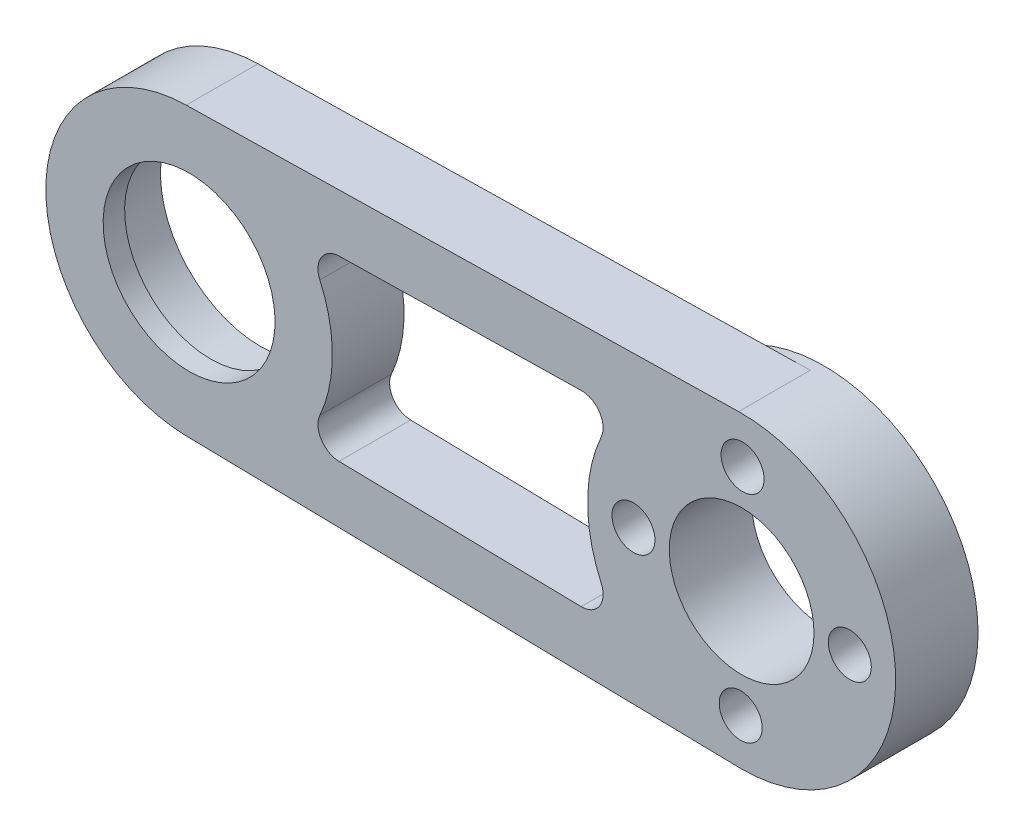
ISO-10303-21;
HEADER;
FILE_DESCRIPTION(('STEP AP214'),'2;1');
FILE_NAME('part.step','',(''),(''),'','','');
FILE_SCHEMA(('AUTOMOTIVE_DESIGN { 1 0 10303 214 1 1 1 1 }'));
ENDSEC;
DATA;
#1=APPLICATION_CONTEXT('core data for automotive mechanical design processes');
#2=APPLICATION_PROTOCOL_DEFINITION('international standard','automotive_design',2000,#1);
#3=PRODUCT_CONTEXT('',#1,'mechanical');
#4=PRODUCT('Part','Part','',(#3));
#5=PRODUCT_RELATED_PRODUCT_CATEGORY('part','',(#4));
#6=PRODUCT_DEFINITION_FORMATION('','',#4);
#7=PRODUCT_DEFINITION_CONTEXT('part definition',#1,'design');
#8=PRODUCT_DEFINITION('design','',#6,#7);
#9=PRODUCT_DEFINITION_SHAPE('','',#8);
#10=(LENGTH_UNIT() NAMED_UNIT(*) SI_UNIT(.MILLI.,.METRE.));
#11=(NAMED_UNIT(*) PLANE_ANGLE_UNIT() SI_UNIT($,.RADIAN.));
#12=(NAMED_UNIT(*) SI_UNIT($,.STERADIAN.) SOLID_ANGLE_UNIT());
#13=UNCERTAINTY_MEASURE_WITH_UNIT(LENGTH_MEASURE(1.E-05),#10,'distance_accuracy_value','');
#14=(GEOMETRIC_REPRESENTATION_CONTEXT(3) GLOBAL_UNCERTAINTY_ASSIGNED_CONTEXT((#13)) GLOBAL_UNIT_ASSIGNED_CONTEXT((#10,
#11,#12)) REPRESENTATION_CONTEXT('',''));
#15=CARTESIAN_POINT('',(0.,0.,0.));
#16=DIRECTION('',(0.,0.,1.));
#17=DIRECTION('',(1.,0.,0.));
#18=AXIS2_PLACEMENT_3D('',#15,#16,#17);
#19=CARTESIAN_POINT('',(39.3125,0.,89.2));
#20=DIRECTION('',(0.,0.,1.));
#21=DIRECTION('',(0.,1.,0.));
#22=AXIS2_PLACEMENT_3D('',#19,#20,#21);
#23=PLANE('',#22);
#24=CARTESIAN_POINT('',(62.0255521809238,0.129133880124579,89.2));
#25=DIRECTION('',(0.,0.,1.));
#26=DIRECTION('',(1.,0.,0.));
#27=AXIS2_PLACEMENT_3D('',#24,#25,#26);
#28=CIRCLE('',#27,3.00000000000002);
#29=CARTESIAN_POINT('',(65.0255521809238,0.129133880124579,89.2));
#30=VERTEX_POINT('',#29);
#31=EDGE_CURVE('E219',#30,#30,#28,.T.);
#32=ORIENTED_EDGE('',*,*,#31,.F.);
#33=EDGE_LOOP('',(#32));
#34=FACE_BOUND('',#33,.T.);
#35=CARTESIAN_POINT('',(77.2541338801246,15.0994478190762,89.2));
#36=DIRECTION('',(0.,0.,1.));
#37=DIRECTION('',(1.,0.,0.));
#38=AXIS2_PLACEMENT_3D('',#35,#36,#37);
#39=CIRCLE('',#38,3.00000000000002);
#40=CARTESIAN_POINT('',(80.2541338801246,15.0994478190762,89.2));
#41=VERTEX_POINT('',#40);
#42=EDGE_CURVE('E618',#41,#41,#39,.T.);
#43=ORIENTED_EDGE('',*,*,#42,.F.);
#44=EDGE_LOOP('',(#43));
#45=FACE_BOUND('',#44,.T.);
#46=CARTESIAN_POINT('',(92.2244478190762,-0.129133880124577,89.2));
#47=DIRECTION('',(0.,0.,1.));
#48=DIRECTION('',(1.,0.,0.));
#49=AXIS2_PLACEMENT_3D('',#46,#47,#48);
#50=CIRCLE('',#49,3.00000000000002);
#51=CARTESIAN_POINT('',(95.2244478190762,-0.129133880124577,89.2));
#52=VERTEX_POINT('',#51);
#53=EDGE_CURVE('E626',#52,#52,#50,.T.);
#54=ORIENTED_EDGE('',*,*,#53,.F.);
#55=EDGE_LOOP('',(#54));
#56=FACE_BOUND('',#55,.T.);
#57=CARTESIAN_POINT('',(76.9958661198754,-15.0994478190762,89.2));
#58=DIRECTION('',(0.,0.,1.));
#59=DIRECTION('',(1.,0.,0.));
#60=AXIS2_PLACEMENT_3D('',#57,#58,#59);
#61=CIRCLE('',#60,3.00000000000002);
#62=CARTESIAN_POINT('',(79.9958661198755,-15.0994478190762,89.2));
#63=VERTEX_POINT('',#62);
#64=EDGE_CURVE('E631',#63,#63,#61,.T.);
#65=ORIENTED_EDGE('',*,*,#64,.F.);
#66=EDGE_LOOP('',(#65));
#67=FACE_BOUND('',#66,.T.);
#68=CARTESIAN_POINT('',(54.7890294242375,10.0674931556305,89.2));
#69=DIRECTION('',(0.,0.,1.));
#70=DIRECTION('',(0.834598495743948,0.55085873951671,0.));
#71=AXIS2_PLACEMENT_3D('',#68,#69,#70);
#72=CIRCLE('',#71,3.);
#73=CARTESIAN_POINT('',(57.5240462294328,8.8347388916758,89.2));
#74=VERTEX_POINT('',#73);
#75=CARTESIAN_POINT('',(54.7306825846913,13.0669257096839,89.2));
#76=VERTEX_POINT('',#75);
#77=EDGE_CURVE('E242',#74,#76,#72,.T.);
#78=ORIENTED_EDGE('',*,*,#77,.F.);
#79=CARTESIAN_POINT('',(77.125,0.,89.2));
#80=DIRECTION('',(0.,0.,-1.));
#81=DIRECTION('',(0.,-1.,0.));
#82=AXIS2_PLACEMENT_3D('',#79,#80,#81);
#83=CIRCLE('',#82,21.5);
#84=CARTESIAN_POINT('',(57.5240462294328,-8.8347388916758,89.2));
#85=VERTEX_POINT('',#84);
#86=EDGE_CURVE('E301',#85,#74,#83,.T.);
#87=ORIENTED_EDGE('',*,*,#86,.F.);
#88=CARTESIAN_POINT('',(54.7890294242375,-10.0674931556305,89.2));
#89=DIRECTION('',(0.,0.,1.));
#90=DIRECTION('',(0.834598495743948,-0.55085873951671,0.));
#91=AXIS2_PLACEMENT_3D('',#88,#89,#90);
#92=CIRCLE('',#91,3.);
#93=CARTESIAN_POINT('',(54.7306825846913,-13.0669257096839,89.2));
#94=VERTEX_POINT('',#93);
#95=EDGE_CURVE('E252',#94,#85,#92,.T.);
#96=ORIENTED_EDGE('',*,*,#95,.F.);
#97=DIRECTION('',(0.999810851351115,-0.0194489465153972,0.));
#98=VECTOR('',#97,1.);
#99=CARTESIAN_POINT('',(49.5983229947105,-12.9670878383221,89.2));
#100=LINE('',#99,#98);
#101=CARTESIAN_POINT('',(20.9286196080458,-12.4093868221489,89.2));
#102=VERTEX_POINT('',#101);
#103=EDGE_CURVE('E195',#102,#94,#100,.T.);
#104=ORIENTED_EDGE('',*,*,#103,.F.);
#105=CARTESIAN_POINT('',(20.9869664475919,-9.40995426809553,89.2));
#106=DIRECTION('',(0.,0.,1.));
#107=DIRECTION('',(-0.844629437346953,-0.535351392607669,0.));
#108=AXIS2_PLACEMENT_3D('',#105,#106,#107);
#109=CIRCLE('',#108,3.);
#110=CARTESIAN_POINT('',(18.2495360413844,-8.18256892877871,89.2));
#111=VERTEX_POINT('',#110);
#112=EDGE_CURVE('E203',#111,#102,#109,.T.);
#113=ORIENTED_EDGE('',*,*,#112,.F.);
#114=CARTESIAN_POINT('',(0.,0.,89.2));
#115=DIRECTION('',(0.,0.,-1.));
#116=DIRECTION('',(-0.0194489465153973,-0.999810851351115,0.));
#117=AXIS2_PLACEMENT_3D('',#114,#115,#116);
#118=CIRCLE('',#117,20.);
#119=CARTESIAN_POINT('',(18.2495360413844,8.18256892877871,89.2));
#120=VERTEX_POINT('',#119);
#121=EDGE_CURVE('E238',#120,#111,#118,.T.);
#122=ORIENTED_EDGE('',*,*,#121,.F.);
#123=CARTESIAN_POINT('',(20.9869664475919,9.4099542680955,89.2));
#124=DIRECTION('',(0.,0.,1.));
#125=DIRECTION('',(-0.844629437346952,0.53535139260767,0.));
#126=AXIS2_PLACEMENT_3D('',#123,#124,#125);
#127=CIRCLE('',#126,3.);
#128=CARTESIAN_POINT('',(20.9286196080458,12.4093868221489,89.2));
#129=VERTEX_POINT('',#128);
#130=EDGE_CURVE('E229',#129,#120,#127,.T.);
#131=ORIENTED_EDGE('',*,*,#130,.F.);
#132=DIRECTION('',(-0.999810851351115,-0.0194489465153972,0.));
#133=VECTOR('',#132,1.);
#134=CARTESIAN_POINT('',(27.4139142496106,12.5355428330083,89.2));
#135=LINE('',#134,#133);
#136=EDGE_CURVE('E225',#76,#129,#135,.T.);
#137=ORIENTED_EDGE('',*,*,#136,.F.);
#138=EDGE_LOOP('',(#78,#87,#96,#104,#113,#122,#131,#137));
#139=FACE_BOUND('',#138,.T.);
#140=CARTESIAN_POINT('',(77.125,0.,89.2));
#141=DIRECTION('',(0.,0.,-1.));
#142=DIRECTION('',(0.,-1.,0.));
#143=AXIS2_PLACEMENT_3D('',#140,#141,#142);
#144=CIRCLE('',#143,21.5);
#145=CARTESIAN_POINT('',(76.706847649919,21.4959333040489,89.2));
#146=VERTEX_POINT('',#145);
#147=CARTESIAN_POINT('',(76.706847649919,-21.495933304049,89.2));
#148=VERTEX_POINT('',#147);
#149=EDGE_CURVE('E285',#146,#148,#144,.T.);
#150=ORIENTED_EDGE('',*,*,#149,.F.);
#151=DIRECTION('',(0.999810851351115,0.0194489465153971,0.));
#152=VECTOR('',#151,1.);
#153=CARTESIAN_POINT('',(57.807749156792,21.1282962102074,89.2));
#154=LINE('',#153,#152);
#155=CARTESIAN_POINT('',(-0.388978930307898,19.9962170270223,89.2));
#156=VERTEX_POINT('',#155);
#157=EDGE_CURVE('E348',#156,#146,#154,.T.);
#158=ORIENTED_EDGE('',*,*,#157,.F.);
#159=CARTESIAN_POINT('',(0.,0.,89.2));
#160=DIRECTION('',(0.,0.,-1.));
#161=DIRECTION('',(-0.0194489465153973,0.999810851351115,0.));
#162=AXIS2_PLACEMENT_3D('',#159,#160,#161);
#163=CIRCLE('',#162,20.);
#164=CARTESIAN_POINT('',(-0.388978930307898,-19.9962170270223,89.2));
#165=VERTEX_POINT('',#164);
#166=EDGE_CURVE('E70',#165,#156,#163,.T.);
#167=ORIENTED_EDGE('',*,*,#166,.F.);
#168=DIRECTION('',(-0.999810851351115,0.0194489465153972,0.));
#169=VECTOR('',#168,1.);
#170=CARTESIAN_POINT('',(19.2598358666786,-20.378438071694,89.2));
#171=LINE('',#170,#169);
#172=EDGE_CURVE('E352',#148,#165,#171,.T.);
#173=ORIENTED_EDGE('',*,*,#172,.F.);
#174=EDGE_LOOP('',(#150,#158,#167,#173));
#175=FACE_BOUND('',#174,.T.);
#176=CARTESIAN_POINT('',(0.,0.,89.2));
#177=DIRECTION('',(0.,0.,1.));
#178=DIRECTION('',(0.,1.,0.));
#179=AXIS2_PLACEMENT_3D('',#176,#177,#178);
#180=CIRCLE('',#179,12.);
#181=CARTESIAN_POINT('',(0.,-12.,89.2));
#182=VERTEX_POINT('',#181);
#183=EDGE_CURVE('E325',#182,#182,#180,.T.);
#184=ORIENTED_EDGE('',*,*,#183,.F.);
#185=EDGE_LOOP('',(#184));
#186=FACE_BOUND('',#185,.T.);
#187=CARTESIAN_POINT('',(77.125,0.,89.2));
#188=DIRECTION('',(0.,0.,1.));
#189=DIRECTION('',(0.,1.,0.));
#190=AXIS2_PLACEMENT_3D('',#187,#188,#189);
#191=CIRCLE('',#190,10.1);
#192=CARTESIAN_POINT('',(77.125,10.1,89.2));
#193=VERTEX_POINT('',#192);
#194=EDGE_CURVE('E11',#193,#193,#191,.T.);
#195=ORIENTED_EDGE('',*,*,#194,.F.);
#196=EDGE_LOOP('',(#195));
#197=FACE_BOUND('',#196,.T.);
#198=ADVANCED_FACE('F51',(#34,#45,#56,#67,#139,#175,#186,#197),#23,.T.);
#199=CARTESIAN_POINT('',(77.125,0.,77.7));
#200=DIRECTION('',(0.,0.,1.));
#201=DIRECTION('',(0.,1.,0.));
#202=AXIS2_PLACEMENT_3D('',#199,#200,#201);
#203=PLANE('',#202);
#204=CARTESIAN_POINT('',(62.0255521809238,0.129133880124579,77.7));
#205=DIRECTION('',(0.,0.,1.));
#206=DIRECTION('',(1.,0.,0.));
#207=AXIS2_PLACEMENT_3D('',#204,#205,#206);
#208=CIRCLE('',#207,3.00000000000002);
#209=CARTESIAN_POINT('',(65.0255521809238,0.129133880124579,77.7));
#210=VERTEX_POINT('',#209);
#211=EDGE_CURVE('E213',#210,#210,#208,.T.);
#212=ORIENTED_EDGE('',*,*,#211,.T.);
#213=EDGE_LOOP('',(#212));
#214=FACE_BOUND('',#213,.T.);
#215=CARTESIAN_POINT('',(77.2541338801246,15.0994478190762,77.7));
#216=DIRECTION('',(0.,0.,1.));
#217=DIRECTION('',(1.,0.,0.));
#218=AXIS2_PLACEMENT_3D('',#215,#216,#217);
#219=CIRCLE('',#218,3.00000000000002);
#220=CARTESIAN_POINT('',(80.2541338801246,15.0994478190762,77.7));
#221=VERTEX_POINT('',#220);
#222=EDGE_CURVE('E621',#221,#221,#219,.T.);
#223=ORIENTED_EDGE('',*,*,#222,.T.);
#224=EDGE_LOOP('',(#223));
#225=FACE_BOUND('',#224,.T.);
#226=CARTESIAN_POINT('',(92.2244478190762,-0.129133880124577,77.7));
#227=DIRECTION('',(0.,0.,1.));
#228=DIRECTION('',(1.,0.,0.));
#229=AXIS2_PLACEMENT_3D('',#226,#227,#228);
#230=CIRCLE('',#229,3.00000000000002);
#231=CARTESIAN_POINT('',(95.2244478190762,-0.129133880124577,77.7));
#232=VERTEX_POINT('',#231);
#233=EDGE_CURVE('E629',#232,#232,#230,.T.);
#234=ORIENTED_EDGE('',*,*,#233,.T.);
#235=EDGE_LOOP('',(#234));
#236=FACE_BOUND('',#235,.T.);
#237=CARTESIAN_POINT('',(76.9958661198754,-15.0994478190762,77.7));
#238=DIRECTION('',(0.,0.,1.));
#239=DIRECTION('',(1.,0.,0.));
#240=AXIS2_PLACEMENT_3D('',#237,#238,#239);
#241=CIRCLE('',#240,3.00000000000002);
#242=CARTESIAN_POINT('',(79.9958661198755,-15.0994478190762,77.7));
#243=VERTEX_POINT('',#242);
#244=EDGE_CURVE('E222',#243,#243,#241,.T.);
#245=ORIENTED_EDGE('',*,*,#244,.T.);
#246=EDGE_LOOP('',(#245));
#247=FACE_BOUND('',#246,.T.);
#248=CARTESIAN_POINT('',(77.125,0.,77.7));
#249=DIRECTION('',(0.,0.,1.));
#250=DIRECTION('',(0.,1.,0.));
#251=AXIS2_PLACEMENT_3D('',#248,#249,#250);
#252=CIRCLE('',#251,10.1);
#253=CARTESIAN_POINT('',(77.125,10.1,77.7));
#254=VERTEX_POINT('',#253);
#255=EDGE_CURVE('E59',#254,#254,#252,.T.);
#256=ORIENTED_EDGE('',*,*,#255,.T.);
#257=EDGE_LOOP('',(#256));
#258=FACE_BOUND('',#257,.T.);
#259=CARTESIAN_POINT('',(77.125,0.,77.7));
#260=DIRECTION('',(0.,0.,-1.));
#261=DIRECTION('',(0.,-1.,0.));
#262=AXIS2_PLACEMENT_3D('',#259,#260,#261);
#263=CIRCLE('',#262,21.5);
#264=CARTESIAN_POINT('',(77.125,-21.5,77.7));
#265=VERTEX_POINT('',#264);
#266=EDGE_CURVE('E276',#265,#265,#263,.T.);
#267=ORIENTED_EDGE('',*,*,#266,.T.);
#268=EDGE_LOOP('',(#267));
#269=FACE_BOUND('',#268,.T.);
#270=ADVANCED_FACE('F499',(#214,#225,#236,#247,#258,#269),#203,.F.);
#271=CARTESIAN_POINT('',(77.125,0.,79.2));
#272=DIRECTION('',(0.,0.,-1.));
#273=DIRECTION('',(0.,1.,0.));
#274=AXIS2_PLACEMENT_3D('',#271,#272,#273);
#275=CYLINDRICAL_SURFACE('',#274,10.1);
#276=ORIENTED_EDGE('',*,*,#194,.T.);
#277=EDGE_LOOP('',(#276));
#278=FACE_BOUND('',#277,.T.);
#279=ORIENTED_EDGE('',*,*,#255,.F.);
#280=EDGE_LOOP('',(#279));
#281=FACE_BOUND('',#280,.T.);
#282=ADVANCED_FACE('F491',(#278,#281),#275,.F.);
#283=CARTESIAN_POINT('',(0.,0.,79.2));
#284=DIRECTION('',(0.,0.,1.));
#285=DIRECTION('',(-0.0194489465153973,0.999810851351115,0.));
#286=AXIS2_PLACEMENT_3D('',#283,#284,#285);
#287=CYLINDRICAL_SURFACE('',#286,20.);
#288=CARTESIAN_POINT('',(0.,0.,79.2));
#289=DIRECTION('',(0.,0.,1.));
#290=DIRECTION('',(-0.0194489465153973,0.999810851351115,0.));
#291=AXIS2_PLACEMENT_3D('',#288,#289,#290);
#292=CIRCLE('',#291,20.);
#293=CARTESIAN_POINT('',(-0.388978930307898,19.9962170270223,79.2));
#294=VERTEX_POINT('',#293);
#295=CARTESIAN_POINT('',(-0.388978930307898,-19.9962170270223,79.2));
#296=VERTEX_POINT('',#295);
#297=EDGE_CURVE('E309',#294,#296,#292,.T.);
#298=ORIENTED_EDGE('',*,*,#297,.T.);
#299=DIRECTION('',(0.,0.,1.));
#300=VECTOR('',#299,1.);
#301=CARTESIAN_POINT('',(-0.388978930307898,-19.9962170270223,79.2));
#302=LINE('',#301,#300);
#303=EDGE_CURVE('E356',#296,#165,#302,.T.);
#304=ORIENTED_EDGE('',*,*,#303,.T.);
#305=ORIENTED_EDGE('',*,*,#166,.T.);
#306=DIRECTION('',(0.,0.,1.));
#307=VECTOR('',#306,1.);
#308=CARTESIAN_POINT('',(-0.388978930307898,19.9962170270223,79.2));
#309=LINE('',#308,#307);
#310=EDGE_CURVE('E280',#294,#156,#309,.T.);
#311=ORIENTED_EDGE('',*,*,#310,.F.);
#312=EDGE_LOOP('',(#298,#304,#305,#311));
#313=FACE_BOUND('',#312,.T.);
#314=ADVANCED_FACE('F482',(#313),#287,.T.);
#315=CARTESIAN_POINT('',(-0.388978930307898,-19.9962170270223,79.2));
#316=DIRECTION('',(-0.0194489465153972,-0.999810851351115,0.));
#317=DIRECTION('',(0.999810851351115,-0.0194489465153972,0.));
#318=AXIS2_PLACEMENT_3D('',#315,#316,#317);
#319=PLANE('',#318);
#320=DIRECTION('',(0.999810851351115,-0.0194489465153972,0.));
#321=VECTOR('',#320,1.);
#322=CARTESIAN_POINT('',(-0.388978930307898,-19.9962170270223,79.2));
#323=LINE('',#322,#321);
#324=CARTESIAN_POINT('',(76.706847649919,-21.495933304049,79.2));
#325=VERTEX_POINT('',#324);
#326=EDGE_CURVE('E306',#296,#325,#323,.T.);
#327=ORIENTED_EDGE('',*,*,#326,.T.);
#328=DIRECTION('',(0.,0.,1.));
#329=VECTOR('',#328,1.);
#330=CARTESIAN_POINT('',(76.706847649919,-21.495933304049,79.2));
#331=LINE('',#330,#329);
#332=EDGE_CURVE('E289',#325,#148,#331,.T.);
#333=ORIENTED_EDGE('',*,*,#332,.T.);
#334=ORIENTED_EDGE('',*,*,#172,.T.);
#335=ORIENTED_EDGE('',*,*,#303,.F.);
#336=EDGE_LOOP('',(#327,#333,#334,#335));
#337=FACE_BOUND('',#336,.T.);
#338=ADVANCED_FACE('F434',(#337),#319,.T.);
#339=CARTESIAN_POINT('',(76.706847649919,21.4959333040489,79.2));
#340=DIRECTION('',(-0.0194489465153971,0.999810851351115,0.));
#341=DIRECTION('',(0.,0.,-1.));
#342=AXIS2_PLACEMENT_3D('',#339,#340,#341);
#343=PLANE('',#342);
#344=DIRECTION('',(-0.999810851351115,-0.0194489465153971,0.));
#345=VECTOR('',#344,1.);
#346=CARTESIAN_POINT('',(76.706847649919,21.4959333040489,79.2));
#347=LINE('',#346,#345);
#348=CARTESIAN_POINT('',(76.706847649919,21.4959333040489,79.2));
#349=VERTEX_POINT('',#348);
#350=EDGE_CURVE('E317',#349,#294,#347,.T.);
#351=ORIENTED_EDGE('',*,*,#350,.T.);
#352=ORIENTED_EDGE('',*,*,#310,.T.);
#353=ORIENTED_EDGE('',*,*,#157,.T.);
#354=DIRECTION('',(0.,0.,1.));
#355=VECTOR('',#354,1.);
#356=CARTESIAN_POINT('',(76.706847649919,21.4959333040489,79.2));
#357=LINE('',#356,#355);
#358=EDGE_CURVE('E294',#349,#146,#357,.T.);
#359=ORIENTED_EDGE('',*,*,#358,.F.);
#360=EDGE_LOOP('',(#351,#352,#353,#359));
#361=FACE_BOUND('',#360,.T.);
#362=ADVANCED_FACE('F368',(#361),#343,.T.);
#363=CARTESIAN_POINT('',(0.,0.,79.2));
#364=DIRECTION('',(0.,0.,1.));
#365=DIRECTION('',(0.,1.,0.));
#366=AXIS2_PLACEMENT_3D('',#363,#364,#365);
#367=CYLINDRICAL_SURFACE('',#366,14.);
#368=CARTESIAN_POINT('',(0.,0.,86.2));
#369=DIRECTION('',(0.,0.,-1.));
#370=DIRECTION('',(0.,1.,0.));
#371=AXIS2_PLACEMENT_3D('',#368,#369,#370);
#372=CIRCLE('',#371,14.);
#373=CARTESIAN_POINT('',(0.,-14.,86.2));
#374=VERTEX_POINT('',#373);
#375=EDGE_CURVE('E310',#374,#374,#372,.T.);
#376=ORIENTED_EDGE('',*,*,#375,.F.);
#377=DIRECTION('',(0.,0.,-1.));
#378=VECTOR('',#377,1.);
#379=CARTESIAN_POINT('',(0.,-14.,79.2));
#380=LINE('',#379,#378);
#381=CARTESIAN_POINT('',(0.,-14.,79.2));
#382=VERTEX_POINT('',#381);
#383=EDGE_CURVE('E277',#374,#382,#380,.T.);
#384=ORIENTED_EDGE('',*,*,#383,.T.);
#385=CARTESIAN_POINT('',(0.,0.,79.2));
#386=DIRECTION('',(0.,0.,-1.));
#387=DIRECTION('',(0.,1.,0.));
#388=AXIS2_PLACEMENT_3D('',#385,#386,#387);
#389=CIRCLE('',#388,14.);
#390=EDGE_CURVE('E281',#382,#382,#389,.T.);
#391=ORIENTED_EDGE('',*,*,#390,.T.);
#392=ORIENTED_EDGE('',*,*,#383,.F.);
#393=EDGE_LOOP('',(#376,#384,#391,#392));
#394=FACE_BOUND('',#393,.T.);
#395=ADVANCED_FACE('F363',(#394),#367,.F.);
#396=CARTESIAN_POINT('',(39.3125,0.,79.2));
#397=DIRECTION('',(0.,0.,1.));
#398=DIRECTION('',(0.,1.,0.));
#399=AXIS2_PLACEMENT_3D('',#396,#397,#398);
#400=PLANE('',#399);
#401=ORIENTED_EDGE('',*,*,#390,.F.);
#402=EDGE_LOOP('',(#401));
#403=FACE_BOUND('',#402,.T.);
#404=CARTESIAN_POINT('',(77.125,0.,79.2));
#405=DIRECTION('',(0.,0.,1.));
#406=DIRECTION('',(0.,-1.,0.));
#407=AXIS2_PLACEMENT_3D('',#404,#405,#406);
#408=CIRCLE('',#407,21.5);
#409=CARTESIAN_POINT('',(57.5240462294328,-8.8347388916758,79.2));
#410=VERTEX_POINT('',#409);
#411=EDGE_CURVE('E293',#410,#325,#408,.T.);
#412=ORIENTED_EDGE('',*,*,#411,.T.);
#413=ORIENTED_EDGE('',*,*,#326,.F.);
#414=ORIENTED_EDGE('',*,*,#297,.F.);
#415=ORIENTED_EDGE('',*,*,#350,.F.);
#416=CARTESIAN_POINT('',(77.125,0.,79.2));
#417=DIRECTION('',(0.,0.,1.));
#418=DIRECTION('',(0.,-1.,0.));
#419=AXIS2_PLACEMENT_3D('',#416,#417,#418);
#420=CIRCLE('',#419,21.5);
#421=CARTESIAN_POINT('',(57.5240462294328,8.8347388916758,79.2));
#422=VERTEX_POINT('',#421);
#423=EDGE_CURVE('E298',#349,#422,#420,.T.);
#424=ORIENTED_EDGE('',*,*,#423,.T.);
#425=CARTESIAN_POINT('',(54.7890294242375,10.0674931556305,79.2));
#426=DIRECTION('',(0.,0.,-1.));
#427=DIRECTION('',(0.834598495743948,0.55085873951671,0.));
#428=AXIS2_PLACEMENT_3D('',#425,#426,#427);
#429=CIRCLE('',#428,3.);
#430=CARTESIAN_POINT('',(54.7306825846913,13.0669257096839,79.2));
#431=VERTEX_POINT('',#430);
#432=EDGE_CURVE('E194',#431,#422,#429,.T.);
#433=ORIENTED_EDGE('',*,*,#432,.F.);
#434=DIRECTION('',(0.999810851351115,0.0194489465153972,0.));
#435=VECTOR('',#434,1.);
#436=CARTESIAN_POINT('',(15.7635862634331,12.3089133604597,79.2));
#437=LINE('',#436,#435);
#438=CARTESIAN_POINT('',(20.9286196080458,12.4093868221489,79.2));
#439=VERTEX_POINT('',#438);
#440=EDGE_CURVE('E228',#439,#431,#437,.T.);
#441=ORIENTED_EDGE('',*,*,#440,.F.);
#442=CARTESIAN_POINT('',(20.9869664475919,9.4099542680955,79.2));
#443=DIRECTION('',(0.,0.,-1.));
#444=DIRECTION('',(-0.844629437346952,0.53535139260767,0.));
#445=AXIS2_PLACEMENT_3D('',#442,#443,#444);
#446=CIRCLE('',#445,3.);
#447=CARTESIAN_POINT('',(18.2495360413844,8.18256892877871,79.2));
#448=VERTEX_POINT('',#447);
#449=EDGE_CURVE('E259',#448,#439,#446,.T.);
#450=ORIENTED_EDGE('',*,*,#449,.F.);
#451=CARTESIAN_POINT('',(0.,0.,79.2));
#452=DIRECTION('',(0.,0.,1.));
#453=DIRECTION('',(-0.0194489465153973,-0.999810851351115,0.));
#454=AXIS2_PLACEMENT_3D('',#451,#452,#453);
#455=CIRCLE('',#454,20.);
#456=CARTESIAN_POINT('',(18.2495360413844,-8.18256892877871,79.2));
#457=VERTEX_POINT('',#456);
#458=EDGE_CURVE('E205',#457,#448,#455,.T.);
#459=ORIENTED_EDGE('',*,*,#458,.F.);
#460=CARTESIAN_POINT('',(20.9869664475919,-9.40995426809553,79.2));
#461=DIRECTION('',(0.,0.,-1.));
#462=DIRECTION('',(-0.844629437346953,-0.535351392607669,0.));
#463=AXIS2_PLACEMENT_3D('',#460,#461,#462);
#464=CIRCLE('',#463,3.);
#465=CARTESIAN_POINT('',(20.9286196080458,-12.4093868221489,79.2));
#466=VERTEX_POINT('',#465);
#467=EDGE_CURVE('E201',#466,#457,#464,.T.);
#468=ORIENTED_EDGE('',*,*,#467,.F.);
#469=DIRECTION('',(-0.999810851351115,0.0194489465153972,0.));
#470=VECTOR('',#469,1.);
#471=CARTESIAN_POINT('',(60.1324037536325,-13.1720033710874,79.2));
#472=LINE('',#471,#470);
#473=CARTESIAN_POINT('',(54.7306825846913,-13.0669257096839,79.2));
#474=VERTEX_POINT('',#473);
#475=EDGE_CURVE('E182',#474,#466,#472,.T.);
#476=ORIENTED_EDGE('',*,*,#475,.F.);
#477=CARTESIAN_POINT('',(54.7890294242375,-10.0674931556305,79.2));
#478=DIRECTION('',(0.,0.,-1.));
#479=DIRECTION('',(0.834598495743948,-0.55085873951671,0.));
#480=AXIS2_PLACEMENT_3D('',#477,#478,#479);
#481=CIRCLE('',#480,3.);
#482=EDGE_CURVE('E241',#410,#474,#481,.T.);
#483=ORIENTED_EDGE('',*,*,#482,.F.);
#484=EDGE_LOOP('',(#412,#413,#414,#415,#424,#433,#441,#450,#459,#468,#476,#483));
#485=FACE_BOUND('',#484,.T.);
#486=ADVANCED_FACE('F208',(#403,#485),#400,.F.);
#487=CARTESIAN_POINT('',(39.3125,0.,86.2));
#488=DIRECTION('',(0.,0.,1.));
#489=DIRECTION('',(0.,1.,0.));
#490=AXIS2_PLACEMENT_3D('',#487,#488,#489);
#491=PLANE('',#490);
#492=CARTESIAN_POINT('',(0.,0.,86.2));
#493=DIRECTION('',(0.,0.,1.));
#494=DIRECTION('',(0.,1.,0.));
#495=AXIS2_PLACEMENT_3D('',#492,#493,#494);
#496=CIRCLE('',#495,12.);
#497=CARTESIAN_POINT('',(0.,-12.,86.2));
#498=VERTEX_POINT('',#497);
#499=EDGE_CURVE('E333',#498,#498,#496,.T.);
#500=ORIENTED_EDGE('',*,*,#499,.T.);
#501=EDGE_LOOP('',(#500));
#502=FACE_BOUND('',#501,.T.);
#503=ORIENTED_EDGE('',*,*,#375,.T.);
#504=EDGE_LOOP('',(#503));
#505=FACE_BOUND('',#504,.T.);
#506=ADVANCED_FACE('F419',(#502,#505),#491,.F.);
#507=CARTESIAN_POINT('',(0.,0.,79.2));
#508=DIRECTION('',(0.,0.,1.));
#509=DIRECTION('',(0.,1.,0.));
#510=AXIS2_PLACEMENT_3D('',#507,#508,#509);
#511=CYLINDRICAL_SURFACE('',#510,12.);
#512=ORIENTED_EDGE('',*,*,#183,.T.);
#513=DIRECTION('',(0.,0.,-1.));
#514=VECTOR('',#513,1.);
#515=CARTESIAN_POINT('',(0.,-12.,79.2));
#516=LINE('',#515,#514);
#517=EDGE_CURVE('E329',#182,#498,#516,.T.);
#518=ORIENTED_EDGE('',*,*,#517,.T.);
#519=ORIENTED_EDGE('',*,*,#499,.F.);
#520=ORIENTED_EDGE('',*,*,#517,.F.);
#521=EDGE_LOOP('',(#512,#518,#519,#520));
#522=FACE_BOUND('',#521,.T.);
#523=ADVANCED_FACE('F459',(#522),#511,.F.);
#524=CARTESIAN_POINT('',(15.7635862634331,12.3089133604597,79.2));
#525=DIRECTION('',(0.0194489465153972,-0.999810851351115,0.));
#526=DIRECTION('',(0.,0.,1.));
#527=AXIS2_PLACEMENT_3D('',#524,#525,#526);
#528=PLANE('',#527);
#529=DIRECTION('',(0.,0.,-1.));
#530=VECTOR('',#529,1.);
#531=CARTESIAN_POINT('',(54.7306825846913,13.0669257096839,79.2));
#532=LINE('',#531,#530);
#533=EDGE_CURVE('E246',#76,#431,#532,.T.);
#534=ORIENTED_EDGE('',*,*,#533,.F.);
#535=ORIENTED_EDGE('',*,*,#136,.T.);
#536=DIRECTION('',(0.,0.,1.));
#537=VECTOR('',#536,1.);
#538=CARTESIAN_POINT('',(20.9286196080458,12.4093868221489,79.2));
#539=LINE('',#538,#537);
#540=EDGE_CURVE('E255',#439,#129,#539,.T.);
#541=ORIENTED_EDGE('',*,*,#540,.F.);
#542=ORIENTED_EDGE('',*,*,#440,.T.);
#543=EDGE_LOOP('',(#534,#535,#541,#542));
#544=FACE_BOUND('',#543,.T.);
#545=ADVANCED_FACE('F450',(#544),#528,.T.);
#546=CARTESIAN_POINT('',(20.9869664475919,9.4099542680955,79.2));
#547=DIRECTION('',(0.,0.,1.));
#548=DIRECTION('',(-0.844629437346952,0.53535139260767,0.));
#549=AXIS2_PLACEMENT_3D('',#546,#547,#548);
#550=CYLINDRICAL_SURFACE('',#549,3.);
#551=ORIENTED_EDGE('',*,*,#449,.T.);
#552=ORIENTED_EDGE('',*,*,#540,.T.);
#553=ORIENTED_EDGE('',*,*,#130,.T.);
#554=DIRECTION('',(0.,0.,-1.));
#555=VECTOR('',#554,1.);
#556=CARTESIAN_POINT('',(18.2495360413844,8.18256892877871,79.2));
#557=LINE('',#556,#555);
#558=EDGE_CURVE('E234',#120,#448,#557,.T.);
#559=ORIENTED_EDGE('',*,*,#558,.T.);
#560=EDGE_LOOP('',(#551,#552,#553,#559));
#561=FACE_BOUND('',#560,.T.);
#562=ADVANCED_FACE('F401',(#561),#550,.F.);
#563=CARTESIAN_POINT('',(77.125,0.,79.2));
#564=DIRECTION('',(0.,0.,-1.));
#565=DIRECTION('',(0.,-1.,0.));
#566=AXIS2_PLACEMENT_3D('',#563,#564,#565);
#567=CYLINDRICAL_SURFACE('',#566,21.5);
#568=ORIENTED_EDGE('',*,*,#358,.T.);
#569=ORIENTED_EDGE('',*,*,#149,.T.);
#570=ORIENTED_EDGE('',*,*,#332,.F.);
#571=ORIENTED_EDGE('',*,*,#411,.F.);
#572=DIRECTION('',(0.,0.,-1.));
#573=VECTOR('',#572,1.);
#574=CARTESIAN_POINT('',(57.5240462294328,-8.8347388916758,79.2));
#575=LINE('',#574,#573);
#576=EDGE_CURVE('E248',#85,#410,#575,.T.);
#577=ORIENTED_EDGE('',*,*,#576,.F.);
#578=ORIENTED_EDGE('',*,*,#86,.T.);
#579=DIRECTION('',(0.,0.,1.));
#580=VECTOR('',#579,1.);
#581=CARTESIAN_POINT('',(57.5240462294328,8.8347388916758,79.2));
#582=LINE('',#581,#580);
#583=EDGE_CURVE('E247',#422,#74,#582,.T.);
#584=ORIENTED_EDGE('',*,*,#583,.F.);
#585=ORIENTED_EDGE('',*,*,#423,.F.);
#586=EDGE_LOOP('',(#568,#569,#570,#571,#577,#578,#584,#585));
#587=FACE_BOUND('',#586,.T.);
#588=ORIENTED_EDGE('',*,*,#266,.F.);
#589=EDGE_LOOP('',(#588));
#590=FACE_BOUND('',#589,.T.);
#591=ADVANCED_FACE('F395',(#587,#590),#567,.T.);
#592=CARTESIAN_POINT('',(54.7890294242375,10.0674931556305,79.2));
#593=DIRECTION('',(0.,0.,1.));
#594=DIRECTION('',(0.834598495743948,0.55085873951671,0.));
#595=AXIS2_PLACEMENT_3D('',#592,#593,#594);
#596=CYLINDRICAL_SURFACE('',#595,3.);
#597=ORIENTED_EDGE('',*,*,#432,.T.);
#598=ORIENTED_EDGE('',*,*,#583,.T.);
#599=ORIENTED_EDGE('',*,*,#77,.T.);
#600=ORIENTED_EDGE('',*,*,#533,.T.);
#601=EDGE_LOOP('',(#597,#598,#599,#600));
#602=FACE_BOUND('',#601,.T.);
#603=ADVANCED_FACE('F400',(#602),#596,.F.);
#604=CARTESIAN_POINT('',(60.1324037536325,-13.1720033710874,79.2));
#605=DIRECTION('',(0.0194489465153972,0.999810851351115,0.));
#606=DIRECTION('',(0.,0.,-1.));
#607=AXIS2_PLACEMENT_3D('',#604,#605,#606);
#608=PLANE('',#607);
#609=DIRECTION('',(0.,0.,-1.));
#610=VECTOR('',#609,1.);
#611=CARTESIAN_POINT('',(20.9286196080458,-12.4093868221489,79.2));
#612=LINE('',#611,#610);
#613=EDGE_CURVE('E185',#102,#466,#612,.T.);
#614=ORIENTED_EDGE('',*,*,#613,.F.);
#615=ORIENTED_EDGE('',*,*,#103,.T.);
#616=DIRECTION('',(0.,0.,1.));
#617=VECTOR('',#616,1.);
#618=CARTESIAN_POINT('',(54.7306825846913,-13.0669257096839,79.2));
#619=LINE('',#618,#617);
#620=EDGE_CURVE('E188',#474,#94,#619,.T.);
#621=ORIENTED_EDGE('',*,*,#620,.F.);
#622=ORIENTED_EDGE('',*,*,#475,.T.);
#623=EDGE_LOOP('',(#614,#615,#621,#622));
#624=FACE_BOUND('',#623,.T.);
#625=ADVANCED_FACE('F184',(#624),#608,.T.);
#626=CARTESIAN_POINT('',(54.7890294242375,-10.0674931556305,79.2));
#627=DIRECTION('',(0.,0.,1.));
#628=DIRECTION('',(0.834598495743948,-0.55085873951671,0.));
#629=AXIS2_PLACEMENT_3D('',#626,#627,#628);
#630=CYLINDRICAL_SURFACE('',#629,3.);
#631=ORIENTED_EDGE('',*,*,#482,.T.);
#632=ORIENTED_EDGE('',*,*,#620,.T.);
#633=ORIENTED_EDGE('',*,*,#95,.T.);
#634=ORIENTED_EDGE('',*,*,#576,.T.);
#635=EDGE_LOOP('',(#631,#632,#633,#634));
#636=FACE_BOUND('',#635,.T.);
#637=ADVANCED_FACE('F380',(#636),#630,.F.);
#638=CARTESIAN_POINT('',(0.,0.,79.2));
#639=DIRECTION('',(0.,0.,1.));
#640=DIRECTION('',(-0.0194489465153973,-0.999810851351115,0.));
#641=AXIS2_PLACEMENT_3D('',#638,#639,#640);
#642=CYLINDRICAL_SURFACE('',#641,20.);
#643=DIRECTION('',(0.,0.,1.));
#644=VECTOR('',#643,1.);
#645=CARTESIAN_POINT('',(18.2495360413844,-8.18256892877871,79.2));
#646=LINE('',#645,#644);
#647=EDGE_CURVE('E212',#457,#111,#646,.T.);
#648=ORIENTED_EDGE('',*,*,#647,.F.);
#649=ORIENTED_EDGE('',*,*,#458,.T.);
#650=ORIENTED_EDGE('',*,*,#558,.F.);
#651=ORIENTED_EDGE('',*,*,#121,.T.);
#652=EDGE_LOOP('',(#648,#649,#650,#651));
#653=FACE_BOUND('',#652,.T.);
#654=ADVANCED_FACE('F375',(#653),#642,.T.);
#655=CARTESIAN_POINT('',(20.9869664475919,-9.40995426809553,79.2));
#656=DIRECTION('',(0.,0.,1.));
#657=DIRECTION('',(-0.844629437346953,-0.535351392607669,0.));
#658=AXIS2_PLACEMENT_3D('',#655,#656,#657);
#659=CYLINDRICAL_SURFACE('',#658,3.);
#660=ORIENTED_EDGE('',*,*,#467,.T.);
#661=ORIENTED_EDGE('',*,*,#647,.T.);
#662=ORIENTED_EDGE('',*,*,#112,.T.);
#663=ORIENTED_EDGE('',*,*,#613,.T.);
#664=EDGE_LOOP('',(#660,#661,#662,#663));
#665=FACE_BOUND('',#664,.T.);
#666=ADVANCED_FACE('F199',(#665),#659,.F.);
#667=CARTESIAN_POINT('',(76.9958661198754,-15.0994478190762,77.7));
#668=DIRECTION('',(0.,0.,1.));
#669=DIRECTION('',(1.,0.,0.));
#670=AXIS2_PLACEMENT_3D('',#667,#668,#669);
#671=CYLINDRICAL_SURFACE('',#670,3.00000000000002);
#672=ORIENTED_EDGE('',*,*,#244,.F.);
#673=EDGE_LOOP('',(#672));
#674=FACE_BOUND('',#673,.T.);
#675=ORIENTED_EDGE('',*,*,#64,.T.);
#676=EDGE_LOOP('',(#675));
#677=FACE_BOUND('',#676,.T.);
#678=ADVANCED_FACE('F390',(#674,#677),#671,.F.);
#679=CARTESIAN_POINT('',(92.2244478190762,-0.129133880124577,77.7));
#680=DIRECTION('',(0.,0.,1.));
#681=DIRECTION('',(1.,0.,0.));
#682=AXIS2_PLACEMENT_3D('',#679,#680,#681);
#683=CYLINDRICAL_SURFACE('',#682,3.00000000000002);
#684=ORIENTED_EDGE('',*,*,#233,.F.);
#685=EDGE_LOOP('',(#684));
#686=FACE_BOUND('',#685,.T.);
#687=ORIENTED_EDGE('',*,*,#53,.T.);
#688=EDGE_LOOP('',(#687));
#689=FACE_BOUND('',#688,.T.);
#690=ADVANCED_FACE('F580',(#686,#689),#683,.F.);
#691=CARTESIAN_POINT('',(77.2541338801246,15.0994478190762,77.7));
#692=DIRECTION('',(0.,0.,1.));
#693=DIRECTION('',(1.,0.,0.));
#694=AXIS2_PLACEMENT_3D('',#691,#692,#693);
#695=CYLINDRICAL_SURFACE('',#694,3.00000000000002);
#696=ORIENTED_EDGE('',*,*,#222,.F.);
#697=EDGE_LOOP('',(#696));
#698=FACE_BOUND('',#697,.T.);
#699=ORIENTED_EDGE('',*,*,#42,.T.);
#700=EDGE_LOOP('',(#699));
#701=FACE_BOUND('',#700,.T.);
#702=ADVANCED_FACE('F588',(#698,#701),#695,.F.);
#703=CARTESIAN_POINT('',(62.0255521809238,0.129133880124579,77.7));
#704=DIRECTION('',(0.,0.,1.));
#705=DIRECTION('',(1.,0.,0.));
#706=AXIS2_PLACEMENT_3D('',#703,#704,#705);
#707=CYLINDRICAL_SURFACE('',#706,3.00000000000002);
#708=ORIENTED_EDGE('',*,*,#211,.F.);
#709=EDGE_LOOP('',(#708));
#710=FACE_BOUND('',#709,.T.);
#711=ORIENTED_EDGE('',*,*,#31,.T.);
#712=EDGE_LOOP('',(#711));
#713=FACE_BOUND('',#712,.T.);
#714=ADVANCED_FACE('F597',(#710,#713),#707,.F.);
#715=CLOSED_SHELL('',(#198,#270,#282,#314,#338,#362,#395,#486,#506,#523,#545,#562,#591,#603,
#625,#637,#654,#666,#678,#690,#702,#714));
#716=MANIFOLD_SOLID_BREP('B2',#715);
#717=ADVANCED_BREP_SHAPE_REPRESENTATION('',(#18,#716),#14);
#718=SHAPE_DEFINITION_REPRESENTATION(#9,#717);
ENDSEC;
END-ISO-10303-21;
